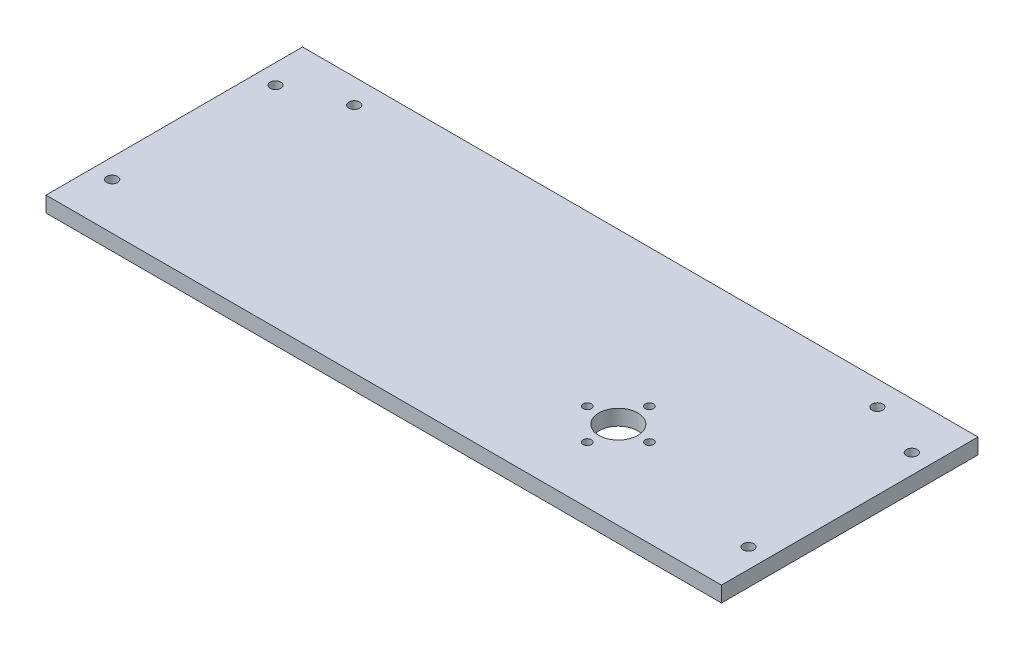
ISO-10303-21;
HEADER;
FILE_DESCRIPTION(('STEP AP214'),'2;1');
FILE_NAME('part.step','',(''),(''),'','','');
FILE_SCHEMA(('AUTOMOTIVE_DESIGN { 1 0 10303 214 1 1 1 1 }'));
ENDSEC;
DATA;
#1=APPLICATION_CONTEXT('core data for automotive mechanical design processes');
#2=APPLICATION_PROTOCOL_DEFINITION('international standard','automotive_design',2000,#1);
#3=PRODUCT_CONTEXT('',#1,'mechanical');
#4=PRODUCT('Part','Part','',(#3));
#5=PRODUCT_RELATED_PRODUCT_CATEGORY('part','',(#4));
#6=PRODUCT_DEFINITION_FORMATION('','',#4);
#7=PRODUCT_DEFINITION_CONTEXT('part definition',#1,'design');
#8=PRODUCT_DEFINITION('design','',#6,#7);
#9=PRODUCT_DEFINITION_SHAPE('','',#8);
#10=(LENGTH_UNIT() NAMED_UNIT(*) SI_UNIT(.MILLI.,.METRE.));
#11=(NAMED_UNIT(*) PLANE_ANGLE_UNIT() SI_UNIT($,.RADIAN.));
#12=(NAMED_UNIT(*) SI_UNIT($,.STERADIAN.) SOLID_ANGLE_UNIT());
#13=UNCERTAINTY_MEASURE_WITH_UNIT(LENGTH_MEASURE(1.E-05),#10,'distance_accuracy_value','');
#14=(GEOMETRIC_REPRESENTATION_CONTEXT(3) GLOBAL_UNCERTAINTY_ASSIGNED_CONTEXT((#13)) GLOBAL_UNIT_ASSIGNED_CONTEXT((#10,
#11,#12)) REPRESENTATION_CONTEXT('',''));
#15=CARTESIAN_POINT('',(0.,0.,0.));
#16=DIRECTION('',(0.,0.,1.));
#17=DIRECTION('',(1.,0.,0.));
#18=AXIS2_PLACEMENT_3D('',#15,#16,#17);
#19=CARTESIAN_POINT('',(138.,6.35,-52.413000043));
#20=DIRECTION('',(-1.,0.,0.));
#21=DIRECTION('',(0.,0.,1.));
#22=AXIS2_PLACEMENT_3D('',#19,#20,#21);
#23=PLANE('',#22);
#24=DIRECTION('',(0.,0.,-1.));
#25=VECTOR('',#24,1.);
#26=CARTESIAN_POINT('',(138.,0.,-52.413000043));
#27=LINE('',#26,#25);
#28=CARTESIAN_POINT('',(138.,0.,52.413000043));
#29=VERTEX_POINT('',#28);
#30=CARTESIAN_POINT('',(138.,0.,-52.413000043));
#31=VERTEX_POINT('',#30);
#32=EDGE_CURVE('E110',#29,#31,#27,.T.);
#33=ORIENTED_EDGE('',*,*,#32,.T.);
#34=DIRECTION('',(0.,-1.,0.));
#35=VECTOR('',#34,1.);
#36=CARTESIAN_POINT('',(138.,6.35,-52.413000043));
#37=LINE('',#36,#35);
#38=CARTESIAN_POINT('',(138.,6.35,-52.413000043));
#39=VERTEX_POINT('',#38);
#40=EDGE_CURVE('E11',#39,#31,#37,.T.);
#41=ORIENTED_EDGE('',*,*,#40,.F.);
#42=DIRECTION('',(0.,0.,-1.));
#43=VECTOR('',#42,1.);
#44=CARTESIAN_POINT('',(138.,6.35,-52.413000043));
#45=LINE('',#44,#43);
#46=CARTESIAN_POINT('',(138.,6.35,52.413000043));
#47=VERTEX_POINT('',#46);
#48=EDGE_CURVE('E94',#47,#39,#45,.T.);
#49=ORIENTED_EDGE('',*,*,#48,.F.);
#50=DIRECTION('',(0.,-1.,0.));
#51=VECTOR('',#50,1.);
#52=CARTESIAN_POINT('',(138.,6.35,52.413000043));
#53=LINE('',#52,#51);
#54=EDGE_CURVE('E106',#47,#29,#53,.T.);
#55=ORIENTED_EDGE('',*,*,#54,.T.);
#56=EDGE_LOOP('',(#33,#41,#49,#55));
#57=FACE_BOUND('',#56,.T.);
#58=ADVANCED_FACE('F42',(#57),#23,.F.);
#59=CARTESIAN_POINT('',(-138.,6.35,-52.413000043));
#60=DIRECTION('',(0.,0.,1.));
#61=DIRECTION('',(1.,0.,0.));
#62=AXIS2_PLACEMENT_3D('',#59,#60,#61);
#63=PLANE('',#62);
#64=DIRECTION('',(-1.,0.,0.));
#65=VECTOR('',#64,1.);
#66=CARTESIAN_POINT('',(-138.,0.,-52.413000043));
#67=LINE('',#66,#65);
#68=CARTESIAN_POINT('',(-138.,0.,-52.413000043));
#69=VERTEX_POINT('',#68);
#70=EDGE_CURVE('E99',#31,#69,#67,.T.);
#71=ORIENTED_EDGE('',*,*,#70,.T.);
#72=DIRECTION('',(0.,-1.,0.));
#73=VECTOR('',#72,1.);
#74=CARTESIAN_POINT('',(-138.,6.35,-52.413000043));
#75=LINE('',#74,#73);
#76=CARTESIAN_POINT('',(-138.,6.35,-52.413000043));
#77=VERTEX_POINT('',#76);
#78=EDGE_CURVE('E51',#77,#69,#75,.T.);
#79=ORIENTED_EDGE('',*,*,#78,.F.);
#80=DIRECTION('',(-1.,0.,0.));
#81=VECTOR('',#80,1.);
#82=CARTESIAN_POINT('',(-138.,6.35,-52.413000043));
#83=LINE('',#82,#81);
#84=EDGE_CURVE('E89',#39,#77,#83,.T.);
#85=ORIENTED_EDGE('',*,*,#84,.F.);
#86=ORIENTED_EDGE('',*,*,#40,.T.);
#87=EDGE_LOOP('',(#71,#79,#85,#86));
#88=FACE_BOUND('',#87,.T.);
#89=ADVANCED_FACE('F98',(#88),#63,.F.);
#90=CARTESIAN_POINT('',(-138.,6.35,-52.413000043));
#91=DIRECTION('',(1.,0.,0.));
#92=DIRECTION('',(0.,0.,-1.));
#93=AXIS2_PLACEMENT_3D('',#90,#91,#92);
#94=PLANE('',#93);
#95=DIRECTION('',(0.,0.,1.));
#96=VECTOR('',#95,1.);
#97=CARTESIAN_POINT('',(-138.,0.,-52.413000043));
#98=LINE('',#97,#96);
#99=CARTESIAN_POINT('',(-138.,0.,52.413000043));
#100=VERTEX_POINT('',#99);
#101=EDGE_CURVE('E76',#69,#100,#98,.T.);
#102=ORIENTED_EDGE('',*,*,#101,.T.);
#103=DIRECTION('',(0.,-1.,0.));
#104=VECTOR('',#103,1.);
#105=CARTESIAN_POINT('',(-138.,6.35,52.413000043));
#106=LINE('',#105,#104);
#107=CARTESIAN_POINT('',(-138.,6.35,52.413000043));
#108=VERTEX_POINT('',#107);
#109=EDGE_CURVE('E101',#108,#100,#106,.T.);
#110=ORIENTED_EDGE('',*,*,#109,.F.);
#111=DIRECTION('',(0.,0.,1.));
#112=VECTOR('',#111,1.);
#113=CARTESIAN_POINT('',(-138.,6.35,-52.413000043));
#114=LINE('',#113,#112);
#115=EDGE_CURVE('E92',#77,#108,#114,.T.);
#116=ORIENTED_EDGE('',*,*,#115,.F.);
#117=ORIENTED_EDGE('',*,*,#78,.T.);
#118=EDGE_LOOP('',(#102,#110,#116,#117));
#119=FACE_BOUND('',#118,.T.);
#120=ADVANCED_FACE('F102',(#119),#94,.F.);
#121=CARTESIAN_POINT('',(-138.,6.35,52.413000043));
#122=DIRECTION('',(0.,0.,-1.));
#123=DIRECTION('',(-1.,0.,0.));
#124=AXIS2_PLACEMENT_3D('',#121,#122,#123);
#125=PLANE('',#124);
#126=DIRECTION('',(1.,0.,0.));
#127=VECTOR('',#126,1.);
#128=CARTESIAN_POINT('',(-138.,0.,52.413000043));
#129=LINE('',#128,#127);
#130=EDGE_CURVE('E82',#100,#29,#129,.T.);
#131=ORIENTED_EDGE('',*,*,#130,.T.);
#132=ORIENTED_EDGE('',*,*,#54,.F.);
#133=DIRECTION('',(1.,0.,0.));
#134=VECTOR('',#133,1.);
#135=CARTESIAN_POINT('',(-138.,6.35,52.413000043));
#136=LINE('',#135,#134);
#137=EDGE_CURVE('E59',#108,#47,#136,.T.);
#138=ORIENTED_EDGE('',*,*,#137,.F.);
#139=ORIENTED_EDGE('',*,*,#109,.T.);
#140=EDGE_LOOP('',(#131,#132,#138,#139));
#141=FACE_BOUND('',#140,.T.);
#142=ADVANCED_FACE('F124',(#141),#125,.F.);
#143=CARTESIAN_POINT('',(0.,6.35,0.));
#144=DIRECTION('',(0.,1.,0.));
#145=DIRECTION('',(0.,0.,1.));
#146=AXIS2_PLACEMENT_3D('',#143,#144,#145);
#147=PLANE('',#146);
#148=CARTESIAN_POINT('',(60.,6.35,3.843000155));
#149=DIRECTION('',(0.,1.,0.));
#150=DIRECTION('',(0.,0.,1.));
#151=AXIS2_PLACEMENT_3D('',#148,#149,#150);
#152=CIRCLE('',#151,1.7);
#153=CARTESIAN_POINT('',(60.,6.35,5.543000155));
#154=VERTEX_POINT('',#153);
#155=EDGE_CURVE('E208',#154,#154,#152,.T.);
#156=ORIENTED_EDGE('',*,*,#155,.F.);
#157=EDGE_LOOP('',(#156));
#158=FACE_BOUND('',#157,.T.);
#159=CARTESIAN_POINT('',(72.7,6.35,16.543000155));
#160=DIRECTION('',(0.,1.,0.));
#161=DIRECTION('',(0.,0.,1.));
#162=AXIS2_PLACEMENT_3D('',#159,#160,#161);
#163=CIRCLE('',#162,1.7);
#164=CARTESIAN_POINT('',(72.7,6.35,18.243000155));
#165=VERTEX_POINT('',#164);
#166=EDGE_CURVE('E204',#165,#165,#163,.T.);
#167=ORIENTED_EDGE('',*,*,#166,.F.);
#168=EDGE_LOOP('',(#167));
#169=FACE_BOUND('',#168,.T.);
#170=CARTESIAN_POINT('',(60.,6.35,29.243000155));
#171=DIRECTION('',(0.,1.,0.));
#172=DIRECTION('',(0.,0.,1.));
#173=AXIS2_PLACEMENT_3D('',#170,#171,#172);
#174=CIRCLE('',#173,1.70000000000001);
#175=CARTESIAN_POINT('',(60.,6.35,30.943000155));
#176=VERTEX_POINT('',#175);
#177=EDGE_CURVE('E196',#176,#176,#174,.T.);
#178=ORIENTED_EDGE('',*,*,#177,.F.);
#179=EDGE_LOOP('',(#178));
#180=FACE_BOUND('',#179,.T.);
#181=CARTESIAN_POINT('',(47.3,6.35,16.543000155));
#182=DIRECTION('',(0.,1.,0.));
#183=DIRECTION('',(0.,0.,1.));
#184=AXIS2_PLACEMENT_3D('',#181,#182,#183);
#185=CIRCLE('',#184,1.69999999999999);
#186=CARTESIAN_POINT('',(47.3,6.35,18.243000155));
#187=VERTEX_POINT('',#186);
#188=EDGE_CURVE('E187',#187,#187,#185,.T.);
#189=ORIENTED_EDGE('',*,*,#188,.F.);
#190=EDGE_LOOP('',(#189));
#191=FACE_BOUND('',#190,.T.);
#192=CARTESIAN_POINT('',(60.,6.35,16.543000155));
#193=DIRECTION('',(0.,1.,0.));
#194=DIRECTION('',(0.,0.,1.));
#195=AXIS2_PLACEMENT_3D('',#192,#193,#194);
#196=CIRCLE('',#195,7.9629);
#197=CARTESIAN_POINT('',(60.,6.35,24.505900155));
#198=VERTEX_POINT('',#197);
#199=EDGE_CURVE('E182',#198,#198,#196,.T.);
#200=ORIENTED_EDGE('',*,*,#199,.F.);
#201=EDGE_LOOP('',(#200));
#202=FACE_BOUND('',#201,.T.);
#203=CARTESIAN_POINT('',(-106.885,6.35,-42.413000043));
#204=DIRECTION('',(0.,1.,0.));
#205=DIRECTION('',(0.,0.,1.));
#206=AXIS2_PLACEMENT_3D('',#203,#204,#205);
#207=CIRCLE('',#206,2.20000000000001);
#208=CARTESIAN_POINT('',(-106.885,6.35,-40.213000043));
#209=VERTEX_POINT('',#208);
#210=EDGE_CURVE('E167',#209,#209,#207,.T.);
#211=ORIENTED_EDGE('',*,*,#210,.F.);
#212=EDGE_LOOP('',(#211));
#213=FACE_BOUND('',#212,.T.);
#214=CARTESIAN_POINT('',(106.885,6.35,-42.413000043));
#215=DIRECTION('',(0.,1.,0.));
#216=DIRECTION('',(0.,0.,1.));
#217=AXIS2_PLACEMENT_3D('',#214,#215,#216);
#218=CIRCLE('',#217,2.20000000000001);
#219=CARTESIAN_POINT('',(106.885,6.35,-40.213000043));
#220=VERTEX_POINT('',#219);
#221=EDGE_CURVE('E163',#220,#220,#218,.T.);
#222=ORIENTED_EDGE('',*,*,#221,.F.);
#223=EDGE_LOOP('',(#222));
#224=FACE_BOUND('',#223,.T.);
#225=CARTESIAN_POINT('',(130.,6.35,-33.363000043));
#226=DIRECTION('',(0.,1.,0.));
#227=DIRECTION('',(0.,0.,-1.));
#228=AXIS2_PLACEMENT_3D('',#225,#226,#227);
#229=CIRCLE('',#228,2.20000000000001);
#230=CARTESIAN_POINT('',(130.,6.35,-35.563000043));
#231=VERTEX_POINT('',#230);
#232=EDGE_CURVE('E139',#231,#231,#229,.T.);
#233=ORIENTED_EDGE('',*,*,#232,.F.);
#234=EDGE_LOOP('',(#233));
#235=FACE_BOUND('',#234,.T.);
#236=CARTESIAN_POINT('',(130.,6.35,33.363000043));
#237=DIRECTION('',(0.,1.,0.));
#238=DIRECTION('',(0.,0.,-1.));
#239=AXIS2_PLACEMENT_3D('',#236,#237,#238);
#240=CIRCLE('',#239,2.20000000000001);
#241=CARTESIAN_POINT('',(130.,6.35,31.163000043));
#242=VERTEX_POINT('',#241);
#243=EDGE_CURVE('E149',#242,#242,#240,.T.);
#244=ORIENTED_EDGE('',*,*,#243,.F.);
#245=EDGE_LOOP('',(#244));
#246=FACE_BOUND('',#245,.T.);
#247=CARTESIAN_POINT('',(-130.,6.35,33.363000043));
#248=DIRECTION('',(0.,1.,0.));
#249=DIRECTION('',(0.,0.,1.));
#250=AXIS2_PLACEMENT_3D('',#247,#248,#249);
#251=CIRCLE('',#250,2.20000000000001);
#252=CARTESIAN_POINT('',(-130.,6.35,35.563000043));
#253=VERTEX_POINT('',#252);
#254=EDGE_CURVE('E138',#253,#253,#251,.T.);
#255=ORIENTED_EDGE('',*,*,#254,.F.);
#256=EDGE_LOOP('',(#255));
#257=FACE_BOUND('',#256,.T.);
#258=CARTESIAN_POINT('',(-130.,6.35,-33.363000043));
#259=DIRECTION('',(0.,1.,0.));
#260=DIRECTION('',(0.,0.,1.));
#261=AXIS2_PLACEMENT_3D('',#258,#259,#260);
#262=CIRCLE('',#261,2.20000000000001);
#263=CARTESIAN_POINT('',(-130.,6.35,-31.163000043));
#264=VERTEX_POINT('',#263);
#265=EDGE_CURVE('E134',#264,#264,#262,.T.);
#266=ORIENTED_EDGE('',*,*,#265,.F.);
#267=EDGE_LOOP('',(#266));
#268=FACE_BOUND('',#267,.T.);
#269=ORIENTED_EDGE('',*,*,#48,.T.);
#270=ORIENTED_EDGE('',*,*,#84,.T.);
#271=ORIENTED_EDGE('',*,*,#115,.T.);
#272=ORIENTED_EDGE('',*,*,#137,.T.);
#273=EDGE_LOOP('',(#269,#270,#271,#272));
#274=FACE_BOUND('',#273,.T.);
#275=ADVANCED_FACE('F90',(#158,#169,#180,#191,#202,#213,#224,#235,#246,#257,#268,#274),#147,.T.);
#276=CARTESIAN_POINT('',(0.,0.,0.));
#277=DIRECTION('',(0.,1.,0.));
#278=DIRECTION('',(0.,0.,1.));
#279=AXIS2_PLACEMENT_3D('',#276,#277,#278);
#280=PLANE('',#279);
#281=CARTESIAN_POINT('',(60.,0.,3.843000155));
#282=DIRECTION('',(0.,1.,0.));
#283=DIRECTION('',(0.,0.,1.));
#284=AXIS2_PLACEMENT_3D('',#281,#282,#283);
#285=CIRCLE('',#284,1.7);
#286=CARTESIAN_POINT('',(60.,0.,5.543000155));
#287=VERTEX_POINT('',#286);
#288=EDGE_CURVE('E186',#287,#287,#285,.F.);
#289=ORIENTED_EDGE('',*,*,#288,.F.);
#290=EDGE_LOOP('',(#289));
#291=FACE_BOUND('',#290,.T.);
#292=CARTESIAN_POINT('',(72.7,0.,16.543000155));
#293=DIRECTION('',(0.,1.,0.));
#294=DIRECTION('',(0.,0.,1.));
#295=AXIS2_PLACEMENT_3D('',#292,#293,#294);
#296=CIRCLE('',#295,1.7);
#297=CARTESIAN_POINT('',(72.7,0.,18.243000155));
#298=VERTEX_POINT('',#297);
#299=EDGE_CURVE('E200',#298,#298,#296,.F.);
#300=ORIENTED_EDGE('',*,*,#299,.F.);
#301=EDGE_LOOP('',(#300));
#302=FACE_BOUND('',#301,.T.);
#303=CARTESIAN_POINT('',(60.,0.,29.243000155));
#304=DIRECTION('',(0.,1.,0.));
#305=DIRECTION('',(0.,0.,1.));
#306=AXIS2_PLACEMENT_3D('',#303,#304,#305);
#307=CIRCLE('',#306,1.70000000000001);
#308=CARTESIAN_POINT('',(60.,0.,30.943000155));
#309=VERTEX_POINT('',#308);
#310=EDGE_CURVE('E191',#309,#309,#307,.F.);
#311=ORIENTED_EDGE('',*,*,#310,.F.);
#312=EDGE_LOOP('',(#311));
#313=FACE_BOUND('',#312,.T.);
#314=CARTESIAN_POINT('',(47.3,0.,16.543000155));
#315=DIRECTION('',(0.,1.,0.));
#316=DIRECTION('',(0.,0.,1.));
#317=AXIS2_PLACEMENT_3D('',#314,#315,#316);
#318=CIRCLE('',#317,1.69999999999999);
#319=CARTESIAN_POINT('',(47.3,0.,18.243000155));
#320=VERTEX_POINT('',#319);
#321=EDGE_CURVE('E192',#320,#320,#318,.F.);
#322=ORIENTED_EDGE('',*,*,#321,.F.);
#323=EDGE_LOOP('',(#322));
#324=FACE_BOUND('',#323,.T.);
#325=CARTESIAN_POINT('',(60.,0.,16.543000155));
#326=DIRECTION('',(0.,1.,0.));
#327=DIRECTION('',(0.,0.,1.));
#328=AXIS2_PLACEMENT_3D('',#325,#326,#327);
#329=CIRCLE('',#328,7.9629);
#330=CARTESIAN_POINT('',(60.,0.,24.505900155));
#331=VERTEX_POINT('',#330);
#332=EDGE_CURVE('E172',#331,#331,#329,.F.);
#333=ORIENTED_EDGE('',*,*,#332,.F.);
#334=EDGE_LOOP('',(#333));
#335=FACE_BOUND('',#334,.T.);
#336=CARTESIAN_POINT('',(-106.885,0.,-42.413000043));
#337=DIRECTION('',(0.,1.,0.));
#338=DIRECTION('',(0.,0.,1.));
#339=AXIS2_PLACEMENT_3D('',#336,#337,#338);
#340=CIRCLE('',#339,2.20000000000001);
#341=CARTESIAN_POINT('',(-106.885,0.,-40.213000043));
#342=VERTEX_POINT('',#341);
#343=EDGE_CURVE('E148',#342,#342,#340,.F.);
#344=ORIENTED_EDGE('',*,*,#343,.F.);
#345=EDGE_LOOP('',(#344));
#346=FACE_BOUND('',#345,.T.);
#347=CARTESIAN_POINT('',(106.885,0.,-42.413000043));
#348=DIRECTION('',(0.,1.,0.));
#349=DIRECTION('',(0.,0.,1.));
#350=AXIS2_PLACEMENT_3D('',#347,#348,#349);
#351=CIRCLE('',#350,2.20000000000001);
#352=CARTESIAN_POINT('',(106.885,0.,-40.213000043));
#353=VERTEX_POINT('',#352);
#354=EDGE_CURVE('E168',#353,#353,#351,.F.);
#355=ORIENTED_EDGE('',*,*,#354,.F.);
#356=EDGE_LOOP('',(#355));
#357=FACE_BOUND('',#356,.T.);
#358=CARTESIAN_POINT('',(130.,0.,-33.363000043));
#359=DIRECTION('',(0.,1.,0.));
#360=DIRECTION('',(0.,0.,1.));
#361=AXIS2_PLACEMENT_3D('',#358,#359,#360);
#362=CIRCLE('',#361,2.20000000000001);
#363=CARTESIAN_POINT('',(130.,0.,-31.163000043));
#364=VERTEX_POINT('',#363);
#365=EDGE_CURVE('E144',#364,#364,#362,.F.);
#366=ORIENTED_EDGE('',*,*,#365,.F.);
#367=EDGE_LOOP('',(#366));
#368=FACE_BOUND('',#367,.T.);
#369=CARTESIAN_POINT('',(130.,0.,33.363000043));
#370=DIRECTION('',(0.,1.,0.));
#371=DIRECTION('',(0.,0.,1.));
#372=AXIS2_PLACEMENT_3D('',#369,#370,#371);
#373=CIRCLE('',#372,2.20000000000001);
#374=CARTESIAN_POINT('',(130.,0.,35.563000043));
#375=VERTEX_POINT('',#374);
#376=EDGE_CURVE('E143',#375,#375,#373,.F.);
#377=ORIENTED_EDGE('',*,*,#376,.F.);
#378=EDGE_LOOP('',(#377));
#379=FACE_BOUND('',#378,.T.);
#380=CARTESIAN_POINT('',(-130.,0.,33.363000043));
#381=DIRECTION('',(0.,1.,0.));
#382=DIRECTION('',(0.,0.,1.));
#383=AXIS2_PLACEMENT_3D('',#380,#381,#382);
#384=CIRCLE('',#383,2.20000000000001);
#385=CARTESIAN_POINT('',(-130.,0.,35.563000043));
#386=VERTEX_POINT('',#385);
#387=EDGE_CURVE('E153',#386,#386,#384,.F.);
#388=ORIENTED_EDGE('',*,*,#387,.F.);
#389=EDGE_LOOP('',(#388));
#390=FACE_BOUND('',#389,.T.);
#391=CARTESIAN_POINT('',(-130.,0.,-33.363000043));
#392=DIRECTION('',(0.,1.,0.));
#393=DIRECTION('',(0.,0.,1.));
#394=AXIS2_PLACEMENT_3D('',#391,#392,#393);
#395=CIRCLE('',#394,2.20000000000001);
#396=CARTESIAN_POINT('',(-130.,0.,-31.163000043));
#397=VERTEX_POINT('',#396);
#398=EDGE_CURVE('E114',#397,#397,#395,.F.);
#399=ORIENTED_EDGE('',*,*,#398,.F.);
#400=EDGE_LOOP('',(#399));
#401=FACE_BOUND('',#400,.T.);
#402=ORIENTED_EDGE('',*,*,#32,.F.);
#403=ORIENTED_EDGE('',*,*,#130,.F.);
#404=ORIENTED_EDGE('',*,*,#101,.F.);
#405=ORIENTED_EDGE('',*,*,#70,.F.);
#406=EDGE_LOOP('',(#402,#403,#404,#405));
#407=FACE_BOUND('',#406,.T.);
#408=ADVANCED_FACE('F127',(#291,#302,#313,#324,#335,#346,#357,#368,#379,#390,#401,#407),#280,.F.);
#409=CARTESIAN_POINT('',(-130.,-0.00100000000000013,-33.363000043));
#410=DIRECTION('',(0.,1.,0.));
#411=DIRECTION('',(0.,0.,1.));
#412=AXIS2_PLACEMENT_3D('',#409,#410,#411);
#413=CYLINDRICAL_SURFACE('',#412,2.20000000000001);
#414=ORIENTED_EDGE('',*,*,#265,.T.);
#415=EDGE_LOOP('',(#414));
#416=FACE_BOUND('',#415,.T.);
#417=ORIENTED_EDGE('',*,*,#398,.T.);
#418=EDGE_LOOP('',(#417));
#419=FACE_BOUND('',#418,.T.);
#420=ADVANCED_FACE('F245',(#416,#419),#413,.F.);
#421=CARTESIAN_POINT('',(-130.,-0.00100000000000013,33.363000043));
#422=DIRECTION('',(0.,1.,0.));
#423=DIRECTION('',(0.,0.,1.));
#424=AXIS2_PLACEMENT_3D('',#421,#422,#423);
#425=CYLINDRICAL_SURFACE('',#424,2.20000000000001);
#426=ORIENTED_EDGE('',*,*,#254,.T.);
#427=EDGE_LOOP('',(#426));
#428=FACE_BOUND('',#427,.T.);
#429=ORIENTED_EDGE('',*,*,#387,.T.);
#430=EDGE_LOOP('',(#429));
#431=FACE_BOUND('',#430,.T.);
#432=ADVANCED_FACE('F248',(#428,#431),#425,.F.);
#433=CARTESIAN_POINT('',(130.,-0.00100000000000013,33.363000043));
#434=DIRECTION('',(0.,1.,0.));
#435=DIRECTION('',(0.,0.,1.));
#436=AXIS2_PLACEMENT_3D('',#433,#434,#435);
#437=CYLINDRICAL_SURFACE('',#436,2.20000000000001);
#438=ORIENTED_EDGE('',*,*,#243,.T.);
#439=EDGE_LOOP('',(#438));
#440=FACE_BOUND('',#439,.T.);
#441=ORIENTED_EDGE('',*,*,#376,.T.);
#442=EDGE_LOOP('',(#441));
#443=FACE_BOUND('',#442,.T.);
#444=ADVANCED_FACE('F297',(#440,#443),#437,.F.);
#445=CARTESIAN_POINT('',(130.,-0.00100000000000013,-33.363000043));
#446=DIRECTION('',(0.,1.,0.));
#447=DIRECTION('',(0.,0.,1.));
#448=AXIS2_PLACEMENT_3D('',#445,#446,#447);
#449=CYLINDRICAL_SURFACE('',#448,2.20000000000001);
#450=ORIENTED_EDGE('',*,*,#232,.T.);
#451=EDGE_LOOP('',(#450));
#452=FACE_BOUND('',#451,.T.);
#453=ORIENTED_EDGE('',*,*,#365,.T.);
#454=EDGE_LOOP('',(#453));
#455=FACE_BOUND('',#454,.T.);
#456=ADVANCED_FACE('F305',(#452,#455),#449,.F.);
#457=CARTESIAN_POINT('',(106.885,-0.00100000000000013,-42.413000043));
#458=DIRECTION('',(0.,1.,0.));
#459=DIRECTION('',(0.,0.,1.));
#460=AXIS2_PLACEMENT_3D('',#457,#458,#459);
#461=CYLINDRICAL_SURFACE('',#460,2.20000000000001);
#462=ORIENTED_EDGE('',*,*,#221,.T.);
#463=EDGE_LOOP('',(#462));
#464=FACE_BOUND('',#463,.T.);
#465=ORIENTED_EDGE('',*,*,#354,.T.);
#466=EDGE_LOOP('',(#465));
#467=FACE_BOUND('',#466,.T.);
#468=ADVANCED_FACE('F313',(#464,#467),#461,.F.);
#469=CARTESIAN_POINT('',(-106.885,-0.00100000000000013,-42.413000043));
#470=DIRECTION('',(0.,1.,0.));
#471=DIRECTION('',(0.,0.,1.));
#472=AXIS2_PLACEMENT_3D('',#469,#470,#471);
#473=CYLINDRICAL_SURFACE('',#472,2.20000000000001);
#474=ORIENTED_EDGE('',*,*,#210,.T.);
#475=EDGE_LOOP('',(#474));
#476=FACE_BOUND('',#475,.T.);
#477=ORIENTED_EDGE('',*,*,#343,.T.);
#478=EDGE_LOOP('',(#477));
#479=FACE_BOUND('',#478,.T.);
#480=ADVANCED_FACE('F321',(#476,#479),#473,.F.);
#481=CARTESIAN_POINT('',(60.,-0.00100000000000013,16.543000155));
#482=DIRECTION('',(0.,1.,0.));
#483=DIRECTION('',(0.,0.,1.));
#484=AXIS2_PLACEMENT_3D('',#481,#482,#483);
#485=CYLINDRICAL_SURFACE('',#484,7.9629);
#486=ORIENTED_EDGE('',*,*,#199,.T.);
#487=EDGE_LOOP('',(#486));
#488=FACE_BOUND('',#487,.T.);
#489=ORIENTED_EDGE('',*,*,#332,.T.);
#490=EDGE_LOOP('',(#489));
#491=FACE_BOUND('',#490,.T.);
#492=ADVANCED_FACE('F329',(#488,#491),#485,.F.);
#493=CARTESIAN_POINT('',(47.3,-0.00100000000000013,16.543000155));
#494=DIRECTION('',(0.,1.,0.));
#495=DIRECTION('',(0.,0.,1.));
#496=AXIS2_PLACEMENT_3D('',#493,#494,#495);
#497=CYLINDRICAL_SURFACE('',#496,1.69999999999999);
#498=ORIENTED_EDGE('',*,*,#188,.T.);
#499=EDGE_LOOP('',(#498));
#500=FACE_BOUND('',#499,.T.);
#501=ORIENTED_EDGE('',*,*,#321,.T.);
#502=EDGE_LOOP('',(#501));
#503=FACE_BOUND('',#502,.T.);
#504=ADVANCED_FACE('F336',(#500,#503),#497,.F.);
#505=CARTESIAN_POINT('',(60.,-0.00100000000000013,29.243000155));
#506=DIRECTION('',(0.,1.,0.));
#507=DIRECTION('',(0.,0.,1.));
#508=AXIS2_PLACEMENT_3D('',#505,#506,#507);
#509=CYLINDRICAL_SURFACE('',#508,1.70000000000001);
#510=ORIENTED_EDGE('',*,*,#177,.T.);
#511=EDGE_LOOP('',(#510));
#512=FACE_BOUND('',#511,.T.);
#513=ORIENTED_EDGE('',*,*,#310,.T.);
#514=EDGE_LOOP('',(#513));
#515=FACE_BOUND('',#514,.T.);
#516=ADVANCED_FACE('F343',(#512,#515),#509,.F.);
#517=CARTESIAN_POINT('',(72.7,-0.00100000000000013,16.543000155));
#518=DIRECTION('',(0.,1.,0.));
#519=DIRECTION('',(0.,0.,1.));
#520=AXIS2_PLACEMENT_3D('',#517,#518,#519);
#521=CYLINDRICAL_SURFACE('',#520,1.7);
#522=ORIENTED_EDGE('',*,*,#166,.T.);
#523=EDGE_LOOP('',(#522));
#524=FACE_BOUND('',#523,.T.);
#525=ORIENTED_EDGE('',*,*,#299,.T.);
#526=EDGE_LOOP('',(#525));
#527=FACE_BOUND('',#526,.T.);
#528=ADVANCED_FACE('F351',(#524,#527),#521,.F.);
#529=CARTESIAN_POINT('',(60.,-0.00100000000000013,3.843000155));
#530=DIRECTION('',(0.,1.,0.));
#531=DIRECTION('',(0.,0.,1.));
#532=AXIS2_PLACEMENT_3D('',#529,#530,#531);
#533=CYLINDRICAL_SURFACE('',#532,1.7);
#534=ORIENTED_EDGE('',*,*,#155,.T.);
#535=EDGE_LOOP('',(#534));
#536=FACE_BOUND('',#535,.T.);
#537=ORIENTED_EDGE('',*,*,#288,.T.);
#538=EDGE_LOOP('',(#537));
#539=FACE_BOUND('',#538,.T.);
#540=ADVANCED_FACE('F219',(#536,#539),#533,.F.);
#541=CLOSED_SHELL('',(#58,#89,#120,#142,#275,#408,#420,#432,#444,#456,#468,#480,#492,#504,#516,
#528,#540));
#542=MANIFOLD_SOLID_BREP('B2',#541);
#543=ADVANCED_BREP_SHAPE_REPRESENTATION('',(#18,#542),#14);
#544=SHAPE_DEFINITION_REPRESENTATION(#9,#543);
ENDSEC;
END-ISO-10303-21;
